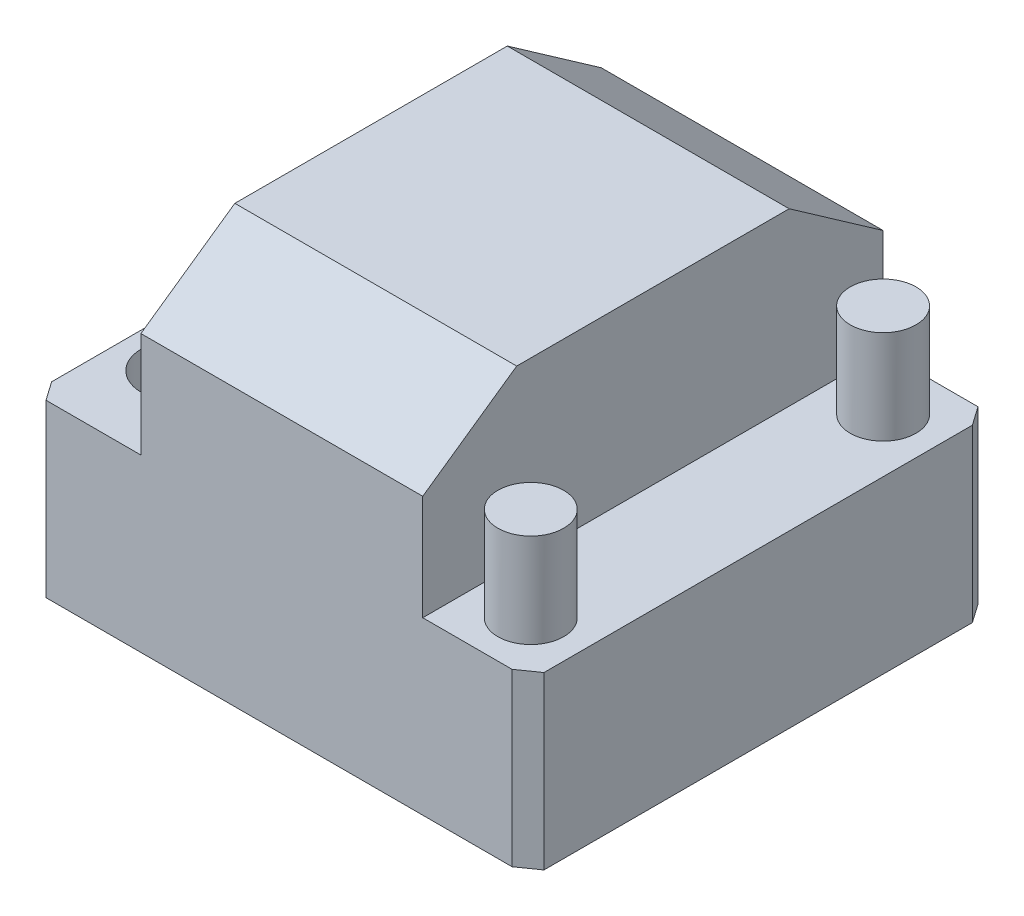
ISO-10303-21;
HEADER;
FILE_DESCRIPTION(('STEP AP214'),'2;1');
FILE_NAME('part.step','',(''),(''),'','','');
FILE_SCHEMA(('AUTOMOTIVE_DESIGN { 1 0 10303 214 1 1 1 1 }'));
ENDSEC;
DATA;
#1=APPLICATION_CONTEXT('core data for automotive mechanical design processes');
#2=APPLICATION_PROTOCOL_DEFINITION('international standard','automotive_design',2000,#1);
#3=PRODUCT_CONTEXT('',#1,'mechanical');
#4=PRODUCT('Part','Part','',(#3));
#5=PRODUCT_RELATED_PRODUCT_CATEGORY('part','',(#4));
#6=PRODUCT_DEFINITION_FORMATION('','',#4);
#7=PRODUCT_DEFINITION_CONTEXT('part definition',#1,'design');
#8=PRODUCT_DEFINITION('design','',#6,#7);
#9=PRODUCT_DEFINITION_SHAPE('','',#8);
#10=(LENGTH_UNIT() NAMED_UNIT(*) SI_UNIT(.MILLI.,.METRE.));
#11=(NAMED_UNIT(*) PLANE_ANGLE_UNIT() SI_UNIT($,.RADIAN.));
#12=(NAMED_UNIT(*) SI_UNIT($,.STERADIAN.) SOLID_ANGLE_UNIT());
#13=UNCERTAINTY_MEASURE_WITH_UNIT(LENGTH_MEASURE(1.E-05),#10,'distance_accuracy_value','');
#14=(GEOMETRIC_REPRESENTATION_CONTEXT(3) GLOBAL_UNCERTAINTY_ASSIGNED_CONTEXT((#13)) GLOBAL_UNIT_ASSIGNED_CONTEXT((#10,
#11,#12)) REPRESENTATION_CONTEXT('',''));
#15=CARTESIAN_POINT('',(0.,0.,0.));
#16=DIRECTION('',(0.,0.,1.));
#17=DIRECTION('',(1.,0.,0.));
#18=AXIS2_PLACEMENT_3D('',#15,#16,#17);
#19=CARTESIAN_POINT('',(0.,36.4,0.));
#20=DIRECTION('',(1.,0.,0.));
#21=DIRECTION('',(0.,0.,-1.));
#22=AXIS2_PLACEMENT_3D('',#19,#20,#21);
#23=PLANE('',#22);
#24=DIRECTION('',(0.,0.,1.));
#25=VECTOR('',#24,1.);
#26=CARTESIAN_POINT('',(0.,18.2,0.));
#27=LINE('',#26,#25);
#28=CARTESIAN_POINT('',(0.,18.2,1.40041507641941));
#29=VERTEX_POINT('',#28);
#30=CARTESIAN_POINT('',(0.,18.2,47.));
#31=VERTEX_POINT('',#30);
#32=EDGE_CURVE('E165',#29,#31,#27,.T.);
#33=ORIENTED_EDGE('',*,*,#32,.F.);
#34=DIRECTION('',(0.,-1.,0.));
#35=VECTOR('',#34,1.);
#36=CARTESIAN_POINT('',(0.,36.4,1.40041507641941));
#37=LINE('',#36,#35);
#38=CARTESIAN_POINT('',(0.,0.,1.40041507641941));
#39=VERTEX_POINT('',#38);
#40=EDGE_CURVE('E251',#29,#39,#37,.T.);
#41=ORIENTED_EDGE('',*,*,#40,.T.);
#42=DIRECTION('',(0.,0.,1.));
#43=VECTOR('',#42,1.);
#44=CARTESIAN_POINT('',(0.,0.,0.));
#45=LINE('',#44,#43);
#46=CARTESIAN_POINT('',(0.,0.,47.));
#47=VERTEX_POINT('',#46);
#48=EDGE_CURVE('E178',#39,#47,#45,.T.);
#49=ORIENTED_EDGE('',*,*,#48,.T.);
#50=DIRECTION('',(0.,1.,0.));
#51=VECTOR('',#50,1.);
#52=CARTESIAN_POINT('',(0.,36.4,47.));
#53=LINE('',#52,#51);
#54=EDGE_CURVE('E57',#47,#31,#53,.T.);
#55=ORIENTED_EDGE('',*,*,#54,.T.);
#56=EDGE_LOOP('',(#33,#41,#49,#55));
#57=FACE_BOUND('',#56,.T.);
#58=ADVANCED_FACE('F41',(#57),#23,.F.);
#59=CARTESIAN_POINT('',(0.,36.4,49.));
#60=DIRECTION('',(0.,0.,-1.));
#61=DIRECTION('',(-1.,0.,0.));
#62=AXIS2_PLACEMENT_3D('',#59,#60,#61);
#63=PLANE('',#62);
#64=DIRECTION('',(1.,0.,0.));
#65=VECTOR('',#64,1.);
#66=CARTESIAN_POINT('',(0.,0.,49.));
#67=LINE('',#66,#65);
#68=CARTESIAN_POINT('',(1.40041507641943,0.,49.));
#69=VERTEX_POINT('',#68);
#70=CARTESIAN_POINT('',(51.,0.,49.));
#71=VERTEX_POINT('',#70);
#72=EDGE_CURVE('E199',#69,#71,#67,.T.);
#73=ORIENTED_EDGE('',*,*,#72,.T.);
#74=DIRECTION('',(0.,1.,0.));
#75=VECTOR('',#74,1.);
#76=CARTESIAN_POINT('',(51.,36.4,49.));
#77=LINE('',#76,#75);
#78=CARTESIAN_POINT('',(51.,18.2,49.));
#79=VERTEX_POINT('',#78);
#80=EDGE_CURVE('E248',#71,#79,#77,.T.);
#81=ORIENTED_EDGE('',*,*,#80,.T.);
#82=DIRECTION('',(1.,0.,0.));
#83=VECTOR('',#82,1.);
#84=CARTESIAN_POINT('',(53.,18.2,49.));
#85=LINE('',#84,#83);
#86=CARTESIAN_POINT('',(41.5,18.2,49.));
#87=VERTEX_POINT('',#86);
#88=EDGE_CURVE('E191',#87,#79,#85,.T.);
#89=ORIENTED_EDGE('',*,*,#88,.F.);
#90=DIRECTION('',(0.,-1.,0.));
#91=VECTOR('',#90,1.);
#92=CARTESIAN_POINT('',(41.5,36.4,49.));
#93=LINE('',#92,#91);
#94=CARTESIAN_POINT('',(41.5,29.3979246179029,49.));
#95=VERTEX_POINT('',#94);
#96=EDGE_CURVE('E175',#95,#87,#93,.T.);
#97=ORIENTED_EDGE('',*,*,#96,.F.);
#98=DIRECTION('',(-1.,0.,0.));
#99=VECTOR('',#98,1.);
#100=CARTESIAN_POINT('',(11.5,29.3979246179029,49.));
#101=LINE('',#100,#99);
#102=CARTESIAN_POINT('',(11.5,29.3979246179029,49.));
#103=VERTEX_POINT('',#102);
#104=EDGE_CURVE('E222',#95,#103,#101,.T.);
#105=ORIENTED_EDGE('',*,*,#104,.T.);
#106=DIRECTION('',(0.,1.,0.));
#107=VECTOR('',#106,1.);
#108=CARTESIAN_POINT('',(11.5,36.4,49.));
#109=LINE('',#108,#107);
#110=CARTESIAN_POINT('',(11.5,18.2,49.));
#111=VERTEX_POINT('',#110);
#112=EDGE_CURVE('E154',#111,#103,#109,.T.);
#113=ORIENTED_EDGE('',*,*,#112,.F.);
#114=DIRECTION('',(1.,0.,0.));
#115=VECTOR('',#114,1.);
#116=CARTESIAN_POINT('',(0.,18.2,49.));
#117=LINE('',#116,#115);
#118=CARTESIAN_POINT('',(1.40041507641943,18.2,49.));
#119=VERTEX_POINT('',#118);
#120=EDGE_CURVE('E160',#119,#111,#117,.T.);
#121=ORIENTED_EDGE('',*,*,#120,.F.);
#122=DIRECTION('',(0.,-1.,0.));
#123=VECTOR('',#122,1.);
#124=CARTESIAN_POINT('',(1.40041507641943,36.4,49.));
#125=LINE('',#124,#123);
#126=EDGE_CURVE('E245',#119,#69,#125,.T.);
#127=ORIENTED_EDGE('',*,*,#126,.T.);
#128=EDGE_LOOP('',(#73,#81,#89,#97,#105,#113,#121,#127));
#129=FACE_BOUND('',#128,.T.);
#130=ADVANCED_FACE('F290',(#129),#63,.F.);
#131=CARTESIAN_POINT('',(53.,36.4,0.));
#132=DIRECTION('',(-1.,0.,0.));
#133=DIRECTION('',(0.,0.,1.));
#134=AXIS2_PLACEMENT_3D('',#131,#132,#133);
#135=PLANE('',#134);
#136=DIRECTION('',(0.,0.,-1.));
#137=VECTOR('',#136,1.);
#138=CARTESIAN_POINT('',(53.,0.,0.));
#139=LINE('',#138,#137);
#140=CARTESIAN_POINT('',(53.,0.,47.5995849235806));
#141=VERTEX_POINT('',#140);
#142=CARTESIAN_POINT('',(53.,0.,2.00000000000002));
#143=VERTEX_POINT('',#142);
#144=EDGE_CURVE('E202',#141,#143,#139,.T.);
#145=ORIENTED_EDGE('',*,*,#144,.T.);
#146=DIRECTION('',(0.,1.,0.));
#147=VECTOR('',#146,1.);
#148=CARTESIAN_POINT('',(53.,36.4,2.00000000000002));
#149=LINE('',#148,#147);
#150=CARTESIAN_POINT('',(53.,18.2,2.00000000000002));
#151=VERTEX_POINT('',#150);
#152=EDGE_CURVE('E239',#143,#151,#149,.T.);
#153=ORIENTED_EDGE('',*,*,#152,.T.);
#154=DIRECTION('',(0.,0.,1.));
#155=VECTOR('',#154,1.);
#156=CARTESIAN_POINT('',(53.,18.2,0.));
#157=LINE('',#156,#155);
#158=CARTESIAN_POINT('',(53.,18.2,47.5995849235806));
#159=VERTEX_POINT('',#158);
#160=EDGE_CURVE('E187',#151,#159,#157,.T.);
#161=ORIENTED_EDGE('',*,*,#160,.T.);
#162=DIRECTION('',(0.,-1.,0.));
#163=VECTOR('',#162,1.);
#164=CARTESIAN_POINT('',(53.,36.4,47.5995849235806));
#165=LINE('',#164,#163);
#166=EDGE_CURVE('E236',#159,#141,#165,.T.);
#167=ORIENTED_EDGE('',*,*,#166,.T.);
#168=EDGE_LOOP('',(#145,#153,#161,#167));
#169=FACE_BOUND('',#168,.T.);
#170=ADVANCED_FACE('F294',(#169),#135,.F.);
#171=CARTESIAN_POINT('',(0.,36.4,0.));
#172=DIRECTION('',(0.,0.,1.));
#173=DIRECTION('',(1.,0.,0.));
#174=AXIS2_PLACEMENT_3D('',#171,#172,#173);
#175=PLANE('',#174);
#176=DIRECTION('',(1.,0.,0.));
#177=VECTOR('',#176,1.);
#178=CARTESIAN_POINT('',(53.,18.2,0.));
#179=LINE('',#178,#177);
#180=CARTESIAN_POINT('',(41.5,18.2,0.));
#181=VERTEX_POINT('',#180);
#182=CARTESIAN_POINT('',(51.5995849235806,18.2,0.));
#183=VERTEX_POINT('',#182);
#184=EDGE_CURVE('E183',#181,#183,#179,.T.);
#185=ORIENTED_EDGE('',*,*,#184,.T.);
#186=DIRECTION('',(0.,-1.,0.));
#187=VECTOR('',#186,1.);
#188=CARTESIAN_POINT('',(51.5995849235806,36.4,0.));
#189=LINE('',#188,#187);
#190=CARTESIAN_POINT('',(51.5995849235806,0.,0.));
#191=VERTEX_POINT('',#190);
#192=EDGE_CURVE('E225',#183,#191,#189,.T.);
#193=ORIENTED_EDGE('',*,*,#192,.T.);
#194=DIRECTION('',(-1.,0.,0.));
#195=VECTOR('',#194,1.);
#196=CARTESIAN_POINT('',(0.,0.,0.));
#197=LINE('',#196,#195);
#198=CARTESIAN_POINT('',(2.,0.,0.));
#199=VERTEX_POINT('',#198);
#200=EDGE_CURVE('E205',#191,#199,#197,.T.);
#201=ORIENTED_EDGE('',*,*,#200,.T.);
#202=DIRECTION('',(0.,1.,0.));
#203=VECTOR('',#202,1.);
#204=CARTESIAN_POINT('',(2.,36.4,0.));
#205=LINE('',#204,#203);
#206=CARTESIAN_POINT('',(2.,18.2,0.));
#207=VERTEX_POINT('',#206);
#208=EDGE_CURVE('E153',#199,#207,#205,.T.);
#209=ORIENTED_EDGE('',*,*,#208,.T.);
#210=DIRECTION('',(1.,0.,0.));
#211=VECTOR('',#210,1.);
#212=CARTESIAN_POINT('',(0.,18.2,0.));
#213=LINE('',#212,#211);
#214=CARTESIAN_POINT('',(11.5,18.2,0.));
#215=VERTEX_POINT('',#214);
#216=EDGE_CURVE('E144',#207,#215,#213,.T.);
#217=ORIENTED_EDGE('',*,*,#216,.T.);
#218=DIRECTION('',(0.,1.,0.));
#219=VECTOR('',#218,1.);
#220=CARTESIAN_POINT('',(11.5,36.4,0.));
#221=LINE('',#220,#219);
#222=CARTESIAN_POINT('',(11.5,29.3979246179029,0.));
#223=VERTEX_POINT('',#222);
#224=EDGE_CURVE('E149',#215,#223,#221,.T.);
#225=ORIENTED_EDGE('',*,*,#224,.T.);
#226=DIRECTION('',(1.,0.,0.));
#227=VECTOR('',#226,1.);
#228=CARTESIAN_POINT('',(41.5,29.3979246179029,0.));
#229=LINE('',#228,#227);
#230=CARTESIAN_POINT('',(41.5,29.3979246179029,0.));
#231=VERTEX_POINT('',#230);
#232=EDGE_CURVE('E216',#223,#231,#229,.T.);
#233=ORIENTED_EDGE('',*,*,#232,.T.);
#234=DIRECTION('',(0.,-1.,0.));
#235=VECTOR('',#234,1.);
#236=CARTESIAN_POINT('',(41.5,36.4,0.));
#237=LINE('',#236,#235);
#238=EDGE_CURVE('E194',#231,#181,#237,.T.);
#239=ORIENTED_EDGE('',*,*,#238,.T.);
#240=EDGE_LOOP('',(#185,#193,#201,#209,#217,#225,#233,#239));
#241=FACE_BOUND('',#240,.T.);
#242=ADVANCED_FACE('F147',(#241),#175,.F.);
#243=CARTESIAN_POINT('',(0.,36.4,0.));
#244=DIRECTION('',(0.,1.,0.));
#245=DIRECTION('',(0.,0.,1.));
#246=AXIS2_PLACEMENT_3D('',#243,#244,#245);
#247=PLANE('',#246);
#248=DIRECTION('',(0.,0.,1.));
#249=VECTOR('',#248,1.);
#250=CARTESIAN_POINT('',(41.5,36.4,0.));
#251=LINE('',#250,#249);
#252=CARTESIAN_POINT('',(41.5,36.4,10.));
#253=VERTEX_POINT('',#252);
#254=CARTESIAN_POINT('',(41.5,36.4,38.9999999999999));
#255=VERTEX_POINT('',#254);
#256=EDGE_CURVE('E180',#253,#255,#251,.T.);
#257=ORIENTED_EDGE('',*,*,#256,.F.);
#258=DIRECTION('',(-1.,0.,0.));
#259=VECTOR('',#258,1.);
#260=CARTESIAN_POINT('',(11.5,36.4,10.));
#261=LINE('',#260,#259);
#262=CARTESIAN_POINT('',(11.5,36.4,10.));
#263=VERTEX_POINT('',#262);
#264=EDGE_CURVE('E210',#253,#263,#261,.T.);
#265=ORIENTED_EDGE('',*,*,#264,.T.);
#266=DIRECTION('',(0.,0.,1.));
#267=VECTOR('',#266,1.);
#268=CARTESIAN_POINT('',(11.5,36.4,0.));
#269=LINE('',#268,#267);
#270=CARTESIAN_POINT('',(11.5,36.4,38.9999999999999));
#271=VERTEX_POINT('',#270);
#272=EDGE_CURVE('E164',#263,#271,#269,.T.);
#273=ORIENTED_EDGE('',*,*,#272,.T.);
#274=DIRECTION('',(1.,0.,0.));
#275=VECTOR('',#274,1.);
#276=CARTESIAN_POINT('',(41.5,36.4,38.9999999999999));
#277=LINE('',#276,#275);
#278=EDGE_CURVE('E207',#271,#255,#277,.T.);
#279=ORIENTED_EDGE('',*,*,#278,.T.);
#280=EDGE_LOOP('',(#257,#265,#273,#279));
#281=FACE_BOUND('',#280,.T.);
#282=ADVANCED_FACE('F301',(#281),#247,.T.);
#283=CARTESIAN_POINT('',(0.,0.,0.));
#284=DIRECTION('',(0.,1.,0.));
#285=DIRECTION('',(0.,0.,1.));
#286=AXIS2_PLACEMENT_3D('',#283,#284,#285);
#287=PLANE('',#286);
#288=ORIENTED_EDGE('',*,*,#200,.F.);
#289=DIRECTION('',(-0.573576436351044,0.,-0.819152044288994));
#290=VECTOR('',#289,1.);
#291=CARTESIAN_POINT('',(51.5995849235806,0.,0.));
#292=LINE('',#291,#290);
#293=EDGE_CURVE('E234',#191,#143,#292,.F.);
#294=ORIENTED_EDGE('',*,*,#293,.T.);
#295=ORIENTED_EDGE('',*,*,#144,.F.);
#296=DIRECTION('',(0.819152044288993,0.,-0.573576436351044));
#297=VECTOR('',#296,1.);
#298=CARTESIAN_POINT('',(53.,0.,47.5995849235806));
#299=LINE('',#298,#297);
#300=EDGE_CURVE('E232',#141,#71,#299,.F.);
#301=ORIENTED_EDGE('',*,*,#300,.T.);
#302=ORIENTED_EDGE('',*,*,#72,.F.);
#303=DIRECTION('',(0.573576436351046,0.,0.819152044288992));
#304=VECTOR('',#303,1.);
#305=CARTESIAN_POINT('',(1.40041507641943,0.,49.));
#306=LINE('',#305,#304);
#307=EDGE_CURVE('E228',#69,#47,#306,.F.);
#308=ORIENTED_EDGE('',*,*,#307,.T.);
#309=ORIENTED_EDGE('',*,*,#48,.F.);
#310=DIRECTION('',(-0.819152044288993,0.,0.573576436351044));
#311=VECTOR('',#310,1.);
#312=CARTESIAN_POINT('',(0.,0.,1.40041507641941));
#313=LINE('',#312,#311);
#314=EDGE_CURVE('E230',#39,#199,#313,.F.);
#315=ORIENTED_EDGE('',*,*,#314,.T.);
#316=EDGE_LOOP('',(#288,#294,#295,#301,#302,#308,#309,#315));
#317=FACE_BOUND('',#316,.T.);
#318=ADVANCED_FACE('F265',(#317),#287,.F.);
#319=CARTESIAN_POINT('',(53.,18.2,0.));
#320=DIRECTION('',(0.,-1.,0.));
#321=DIRECTION('',(0.,0.,-1.));
#322=AXIS2_PLACEMENT_3D('',#319,#320,#321);
#323=PLANE('',#322);
#324=CARTESIAN_POINT('',(47.25,18.2,5.75));
#325=DIRECTION('',(0.,-1.,0.));
#326=DIRECTION('',(0.,0.,-1.));
#327=AXIS2_PLACEMENT_3D('',#324,#325,#326);
#328=CIRCLE('',#327,3.5);
#329=CARTESIAN_POINT('',(47.25,18.2,2.25));
#330=VERTEX_POINT('',#329);
#331=EDGE_CURVE('E11',#330,#330,#328,.F.);
#332=ORIENTED_EDGE('',*,*,#331,.F.);
#333=EDGE_LOOP('',(#332));
#334=FACE_BOUND('',#333,.T.);
#335=CARTESIAN_POINT('',(47.25,18.2,43.25));
#336=DIRECTION('',(0.,-1.,0.));
#337=DIRECTION('',(0.,0.,-1.));
#338=AXIS2_PLACEMENT_3D('',#335,#336,#337);
#339=CIRCLE('',#338,3.5);
#340=CARTESIAN_POINT('',(47.25,18.2,39.75));
#341=VERTEX_POINT('',#340);
#342=EDGE_CURVE('E50',#341,#341,#339,.F.);
#343=ORIENTED_EDGE('',*,*,#342,.F.);
#344=EDGE_LOOP('',(#343));
#345=FACE_BOUND('',#344,.T.);
#346=ORIENTED_EDGE('',*,*,#160,.F.);
#347=DIRECTION('',(0.573576436351044,0.,0.819152044288994));
#348=VECTOR('',#347,1.);
#349=CARTESIAN_POINT('',(51.5995849235806,18.2,0.));
#350=LINE('',#349,#348);
#351=EDGE_CURVE('E243',#151,#183,#350,.F.);
#352=ORIENTED_EDGE('',*,*,#351,.T.);
#353=ORIENTED_EDGE('',*,*,#184,.F.);
#354=DIRECTION('',(0.,0.,1.));
#355=VECTOR('',#354,1.);
#356=CARTESIAN_POINT('',(41.5,18.2,0.));
#357=LINE('',#356,#355);
#358=EDGE_CURVE('E184',#181,#87,#357,.T.);
#359=ORIENTED_EDGE('',*,*,#358,.T.);
#360=ORIENTED_EDGE('',*,*,#88,.T.);
#361=DIRECTION('',(-0.819152044288993,0.,0.573576436351044));
#362=VECTOR('',#361,1.);
#363=CARTESIAN_POINT('',(53.,18.2,47.5995849235806));
#364=LINE('',#363,#362);
#365=EDGE_CURVE('E241',#79,#159,#364,.F.);
#366=ORIENTED_EDGE('',*,*,#365,.T.);
#367=EDGE_LOOP('',(#346,#352,#353,#359,#360,#366));
#368=FACE_BOUND('',#367,.T.);
#369=ADVANCED_FACE('F261',(#334,#345,#368),#323,.F.);
#370=CARTESIAN_POINT('',(41.5,36.4,0.));
#371=DIRECTION('',(-1.,0.,0.));
#372=DIRECTION('',(0.,0.,1.));
#373=AXIS2_PLACEMENT_3D('',#370,#371,#372);
#374=PLANE('',#373);
#375=ORIENTED_EDGE('',*,*,#238,.F.);
#376=DIRECTION('',(0.,0.573576436351044,0.819152044288993));
#377=VECTOR('',#376,1.);
#378=CARTESIAN_POINT('',(41.5,36.4,10.));
#379=LINE('',#378,#377);
#380=EDGE_CURVE('E220',#231,#253,#379,.T.);
#381=ORIENTED_EDGE('',*,*,#380,.T.);
#382=ORIENTED_EDGE('',*,*,#256,.T.);
#383=DIRECTION('',(0.,-0.573576436351044,0.819152044288993));
#384=VECTOR('',#383,1.);
#385=CARTESIAN_POINT('',(41.5,36.4,38.9999999999999));
#386=LINE('',#385,#384);
#387=EDGE_CURVE('E218',#255,#95,#386,.T.);
#388=ORIENTED_EDGE('',*,*,#387,.T.);
#389=ORIENTED_EDGE('',*,*,#96,.T.);
#390=ORIENTED_EDGE('',*,*,#358,.F.);
#391=EDGE_LOOP('',(#375,#381,#382,#388,#389,#390));
#392=FACE_BOUND('',#391,.T.);
#393=ADVANCED_FACE('F264',(#392),#374,.F.);
#394=CARTESIAN_POINT('',(11.5,36.4,0.));
#395=DIRECTION('',(1.,0.,0.));
#396=DIRECTION('',(0.,0.,-1.));
#397=AXIS2_PLACEMENT_3D('',#394,#395,#396);
#398=PLANE('',#397);
#399=ORIENTED_EDGE('',*,*,#272,.F.);
#400=DIRECTION('',(0.,-0.573576436351044,-0.819152044288993));
#401=VECTOR('',#400,1.);
#402=CARTESIAN_POINT('',(11.5,36.4,10.));
#403=LINE('',#402,#401);
#404=EDGE_CURVE('E169',#263,#223,#403,.T.);
#405=ORIENTED_EDGE('',*,*,#404,.T.);
#406=ORIENTED_EDGE('',*,*,#224,.F.);
#407=DIRECTION('',(0.,0.,1.));
#408=VECTOR('',#407,1.);
#409=CARTESIAN_POINT('',(11.5,18.2,0.));
#410=LINE('',#409,#408);
#411=EDGE_CURVE('E157',#215,#111,#410,.T.);
#412=ORIENTED_EDGE('',*,*,#411,.T.);
#413=ORIENTED_EDGE('',*,*,#112,.T.);
#414=DIRECTION('',(0.,0.573576436351044,-0.819152044288993));
#415=VECTOR('',#414,1.);
#416=CARTESIAN_POINT('',(11.5,36.4,38.9999999999999));
#417=LINE('',#416,#415);
#418=EDGE_CURVE('E213',#103,#271,#417,.T.);
#419=ORIENTED_EDGE('',*,*,#418,.T.);
#420=EDGE_LOOP('',(#399,#405,#406,#412,#413,#419));
#421=FACE_BOUND('',#420,.T.);
#422=ADVANCED_FACE('F168',(#421),#398,.F.);
#423=CARTESIAN_POINT('',(0.,18.2,0.));
#424=DIRECTION('',(0.,-1.,0.));
#425=DIRECTION('',(0.,0.,-1.));
#426=AXIS2_PLACEMENT_3D('',#423,#424,#425);
#427=PLANE('',#426);
#428=CARTESIAN_POINT('',(5.75,18.2,9.2002075382097));
#429=DIRECTION('',(0.,1.,0.));
#430=DIRECTION('',(0.,0.,1.));
#431=AXIS2_PLACEMENT_3D('',#428,#429,#430);
#432=CIRCLE('',#431,4.);
#433=CARTESIAN_POINT('',(5.75,18.2,13.2002075382097));
#434=VERTEX_POINT('',#433);
#435=EDGE_CURVE('E563',#434,#434,#432,.T.);
#436=ORIENTED_EDGE('',*,*,#435,.F.);
#437=EDGE_LOOP('',(#436));
#438=FACE_BOUND('',#437,.T.);
#439=CARTESIAN_POINT('',(5.75,18.2,39.2002075382097));
#440=DIRECTION('',(0.,1.,0.));
#441=DIRECTION('',(0.,0.,1.));
#442=AXIS2_PLACEMENT_3D('',#439,#440,#441);
#443=CIRCLE('',#442,4.);
#444=CARTESIAN_POINT('',(5.75,18.2,43.2002075382097));
#445=VERTEX_POINT('',#444);
#446=EDGE_CURVE('E568',#445,#445,#443,.T.);
#447=ORIENTED_EDGE('',*,*,#446,.F.);
#448=EDGE_LOOP('',(#447));
#449=FACE_BOUND('',#448,.T.);
#450=CARTESIAN_POINT('',(5.75,18.2,24.2002075382097));
#451=DIRECTION('',(0.,1.,0.));
#452=DIRECTION('',(0.,0.,1.));
#453=AXIS2_PLACEMENT_3D('',#450,#451,#452);
#454=CIRCLE('',#453,4.);
#455=CARTESIAN_POINT('',(5.75,18.2,28.2002075382097));
#456=VERTEX_POINT('',#455);
#457=EDGE_CURVE('E576',#456,#456,#454,.T.);
#458=ORIENTED_EDGE('',*,*,#457,.F.);
#459=EDGE_LOOP('',(#458));
#460=FACE_BOUND('',#459,.T.);
#461=ORIENTED_EDGE('',*,*,#216,.F.);
#462=DIRECTION('',(0.819152044288993,0.,-0.573576436351044));
#463=VECTOR('',#462,1.);
#464=CARTESIAN_POINT('',(0.,18.2,1.40041507641941));
#465=LINE('',#464,#463);
#466=EDGE_CURVE('E64',#207,#29,#465,.F.);
#467=ORIENTED_EDGE('',*,*,#466,.T.);
#468=ORIENTED_EDGE('',*,*,#32,.T.);
#469=DIRECTION('',(-0.573576436351046,0.,-0.819152044288992));
#470=VECTOR('',#469,1.);
#471=CARTESIAN_POINT('',(1.40041507641943,18.2,49.));
#472=LINE('',#471,#470);
#473=EDGE_CURVE('E254',#31,#119,#472,.F.);
#474=ORIENTED_EDGE('',*,*,#473,.T.);
#475=ORIENTED_EDGE('',*,*,#120,.T.);
#476=ORIENTED_EDGE('',*,*,#411,.F.);
#477=EDGE_LOOP('',(#461,#467,#468,#474,#475,#476));
#478=FACE_BOUND('',#477,.T.);
#479=ADVANCED_FACE('F158',(#438,#449,#460,#478),#427,.F.);
#480=CARTESIAN_POINT('',(0.,36.4,10.));
#481=DIRECTION('',(0.,0.819152044288993,-0.573576436351044));
#482=DIRECTION('',(1.,0.,0.));
#483=AXIS2_PLACEMENT_3D('',#480,#481,#482);
#484=PLANE('',#483);
#485=ORIENTED_EDGE('',*,*,#380,.F.);
#486=ORIENTED_EDGE('',*,*,#232,.F.);
#487=ORIENTED_EDGE('',*,*,#404,.F.);
#488=ORIENTED_EDGE('',*,*,#264,.F.);
#489=EDGE_LOOP('',(#485,#486,#487,#488));
#490=FACE_BOUND('',#489,.T.);
#491=ADVANCED_FACE('F310',(#490),#484,.T.);
#492=CARTESIAN_POINT('',(0.,36.4,38.9999999999999));
#493=DIRECTION('',(0.,0.819152044288993,0.573576436351044));
#494=DIRECTION('',(-1.,0.,0.));
#495=AXIS2_PLACEMENT_3D('',#492,#493,#494);
#496=PLANE('',#495);
#497=ORIENTED_EDGE('',*,*,#418,.F.);
#498=ORIENTED_EDGE('',*,*,#104,.F.);
#499=ORIENTED_EDGE('',*,*,#387,.F.);
#500=ORIENTED_EDGE('',*,*,#278,.F.);
#501=EDGE_LOOP('',(#497,#498,#499,#500));
#502=FACE_BOUND('',#501,.T.);
#503=ADVANCED_FACE('F316',(#502),#496,.T.);
#504=CARTESIAN_POINT('',(51.5995849235806,36.4,0.));
#505=DIRECTION('',(-0.819152044288994,0.,0.573576436351044));
#506=DIRECTION('',(0.,-1.,0.));
#507=AXIS2_PLACEMENT_3D('',#504,#505,#506);
#508=PLANE('',#507);
#509=ORIENTED_EDGE('',*,*,#351,.F.);
#510=ORIENTED_EDGE('',*,*,#152,.F.);
#511=ORIENTED_EDGE('',*,*,#293,.F.);
#512=ORIENTED_EDGE('',*,*,#192,.F.);
#513=EDGE_LOOP('',(#509,#510,#511,#512));
#514=FACE_BOUND('',#513,.T.);
#515=ADVANCED_FACE('F277',(#514),#508,.F.);
#516=CARTESIAN_POINT('',(53.,36.4,47.5995849235806));
#517=DIRECTION('',(-0.573576436351044,0.,-0.819152044288993));
#518=DIRECTION('',(0.,-1.,0.));
#519=AXIS2_PLACEMENT_3D('',#516,#517,#518);
#520=PLANE('',#519);
#521=ORIENTED_EDGE('',*,*,#365,.F.);
#522=ORIENTED_EDGE('',*,*,#80,.F.);
#523=ORIENTED_EDGE('',*,*,#300,.F.);
#524=ORIENTED_EDGE('',*,*,#166,.F.);
#525=EDGE_LOOP('',(#521,#522,#523,#524));
#526=FACE_BOUND('',#525,.T.);
#527=ADVANCED_FACE('F293',(#526),#520,.F.);
#528=CARTESIAN_POINT('',(0.,36.4,1.40041507641941));
#529=DIRECTION('',(0.573576436351044,0.,0.819152044288993));
#530=DIRECTION('',(0.,-1.,0.));
#531=AXIS2_PLACEMENT_3D('',#528,#529,#530);
#532=PLANE('',#531);
#533=ORIENTED_EDGE('',*,*,#466,.F.);
#534=ORIENTED_EDGE('',*,*,#208,.F.);
#535=ORIENTED_EDGE('',*,*,#314,.F.);
#536=ORIENTED_EDGE('',*,*,#40,.F.);
#537=EDGE_LOOP('',(#533,#534,#535,#536));
#538=FACE_BOUND('',#537,.T.);
#539=ADVANCED_FACE('F284',(#538),#532,.F.);
#540=CARTESIAN_POINT('',(1.40041507641943,36.4,49.));
#541=DIRECTION('',(0.819152044288992,0.,-0.573576436351045));
#542=DIRECTION('',(0.,-1.,0.));
#543=AXIS2_PLACEMENT_3D('',#540,#541,#542);
#544=PLANE('',#543);
#545=ORIENTED_EDGE('',*,*,#473,.F.);
#546=ORIENTED_EDGE('',*,*,#54,.F.);
#547=ORIENTED_EDGE('',*,*,#307,.F.);
#548=ORIENTED_EDGE('',*,*,#126,.F.);
#549=EDGE_LOOP('',(#545,#546,#547,#548));
#550=FACE_BOUND('',#549,.T.);
#551=ADVANCED_FACE('F44',(#550),#544,.F.);
#552=CARTESIAN_POINT('',(47.25,28.2,43.25));
#553=DIRECTION('',(0.,-1.,0.));
#554=DIRECTION('',(0.,0.,-1.));
#555=AXIS2_PLACEMENT_3D('',#552,#553,#554);
#556=CYLINDRICAL_SURFACE('',#555,3.5);
#557=CARTESIAN_POINT('',(47.25,28.2,43.25));
#558=DIRECTION('',(0.,1.,0.));
#559=DIRECTION('',(0.,0.,1.));
#560=AXIS2_PLACEMENT_3D('',#557,#558,#559);
#561=CIRCLE('',#560,3.5);
#562=CARTESIAN_POINT('',(47.25,28.2,46.75));
#563=VERTEX_POINT('',#562);
#564=EDGE_CURVE('E190',#563,#563,#561,.T.);
#565=ORIENTED_EDGE('',*,*,#564,.F.);
#566=EDGE_LOOP('',(#565));
#567=FACE_BOUND('',#566,.T.);
#568=ORIENTED_EDGE('',*,*,#342,.T.);
#569=EDGE_LOOP('',(#568));
#570=FACE_BOUND('',#569,.T.);
#571=ADVANCED_FACE('F259',(#567,#570),#556,.T.);
#572=CARTESIAN_POINT('',(47.25,28.2,43.25));
#573=DIRECTION('',(0.,1.,0.));
#574=DIRECTION('',(0.,0.,1.));
#575=AXIS2_PLACEMENT_3D('',#572,#573,#574);
#576=PLANE('',#575);
#577=ORIENTED_EDGE('',*,*,#564,.T.);
#578=EDGE_LOOP('',(#577));
#579=FACE_BOUND('',#578,.T.);
#580=ADVANCED_FACE('F342',(#579),#576,.T.);
#581=CARTESIAN_POINT('',(47.25,28.2,5.75));
#582=DIRECTION('',(0.,-1.,0.));
#583=DIRECTION('',(0.,0.,-1.));
#584=AXIS2_PLACEMENT_3D('',#581,#582,#583);
#585=CYLINDRICAL_SURFACE('',#584,3.5);
#586=CARTESIAN_POINT('',(47.25,28.2,5.75));
#587=DIRECTION('',(0.,1.,0.));
#588=DIRECTION('',(0.,0.,1.));
#589=AXIS2_PLACEMENT_3D('',#586,#587,#588);
#590=CIRCLE('',#589,3.5);
#591=CARTESIAN_POINT('',(47.25,28.2,9.25));
#592=VERTEX_POINT('',#591);
#593=EDGE_CURVE('E562',#592,#592,#590,.T.);
#594=ORIENTED_EDGE('',*,*,#593,.F.);
#595=EDGE_LOOP('',(#594));
#596=FACE_BOUND('',#595,.T.);
#597=ORIENTED_EDGE('',*,*,#331,.T.);
#598=EDGE_LOOP('',(#597));
#599=FACE_BOUND('',#598,.T.);
#600=ADVANCED_FACE('F348',(#596,#599),#585,.T.);
#601=CARTESIAN_POINT('',(47.25,28.2,5.75));
#602=DIRECTION('',(0.,1.,0.));
#603=DIRECTION('',(0.,0.,1.));
#604=AXIS2_PLACEMENT_3D('',#601,#602,#603);
#605=PLANE('',#604);
#606=ORIENTED_EDGE('',*,*,#593,.T.);
#607=EDGE_LOOP('',(#606));
#608=FACE_BOUND('',#607,.T.);
#609=ADVANCED_FACE('F443',(#608),#605,.T.);
#610=CARTESIAN_POINT('',(5.75,8.2,24.2002075382097));
#611=DIRECTION('',(0.,1.,0.));
#612=DIRECTION('',(0.,0.,1.));
#613=AXIS2_PLACEMENT_3D('',#610,#611,#612);
#614=CYLINDRICAL_SURFACE('',#613,4.);
#615=CARTESIAN_POINT('',(5.75,8.2,24.2002075382097));
#616=DIRECTION('',(0.,1.,0.));
#617=DIRECTION('',(0.,0.,1.));
#618=AXIS2_PLACEMENT_3D('',#615,#616,#617);
#619=CIRCLE('',#618,4.);
#620=CARTESIAN_POINT('',(5.75,8.2,28.2002075382097));
#621=VERTEX_POINT('',#620);
#622=EDGE_CURVE('E579',#621,#621,#619,.T.);
#623=ORIENTED_EDGE('',*,*,#622,.F.);
#624=EDGE_LOOP('',(#623));
#625=FACE_BOUND('',#624,.T.);
#626=ORIENTED_EDGE('',*,*,#457,.T.);
#627=EDGE_LOOP('',(#626));
#628=FACE_BOUND('',#627,.T.);
#629=ADVANCED_FACE('F454',(#625,#628),#614,.F.);
#630=CARTESIAN_POINT('',(5.75,8.2,24.2002075382097));
#631=DIRECTION('',(0.,1.,0.));
#632=DIRECTION('',(0.,0.,1.));
#633=AXIS2_PLACEMENT_3D('',#630,#631,#632);
#634=PLANE('',#633);
#635=ORIENTED_EDGE('',*,*,#622,.T.);
#636=EDGE_LOOP('',(#635));
#637=FACE_BOUND('',#636,.T.);
#638=ADVANCED_FACE('F464',(#637),#634,.T.);
#639=CARTESIAN_POINT('',(5.75,8.2,39.2002075382097));
#640=DIRECTION('',(0.,1.,0.));
#641=DIRECTION('',(0.,0.,1.));
#642=AXIS2_PLACEMENT_3D('',#639,#640,#641);
#643=CYLINDRICAL_SURFACE('',#642,4.);
#644=CARTESIAN_POINT('',(5.75,8.2,39.2002075382097));
#645=DIRECTION('',(0.,1.,0.));
#646=DIRECTION('',(0.,0.,1.));
#647=AXIS2_PLACEMENT_3D('',#644,#645,#646);
#648=CIRCLE('',#647,4.);
#649=CARTESIAN_POINT('',(5.75,8.2,43.2002075382097));
#650=VERTEX_POINT('',#649);
#651=EDGE_CURVE('E573',#650,#650,#648,.T.);
#652=ORIENTED_EDGE('',*,*,#651,.F.);
#653=EDGE_LOOP('',(#652));
#654=FACE_BOUND('',#653,.T.);
#655=ORIENTED_EDGE('',*,*,#446,.T.);
#656=EDGE_LOOP('',(#655));
#657=FACE_BOUND('',#656,.T.);
#658=ADVANCED_FACE('F476',(#654,#657),#643,.F.);
#659=CARTESIAN_POINT('',(5.75,8.2,39.2002075382097));
#660=DIRECTION('',(0.,1.,0.));
#661=DIRECTION('',(0.,0.,1.));
#662=AXIS2_PLACEMENT_3D('',#659,#660,#661);
#663=PLANE('',#662);
#664=ORIENTED_EDGE('',*,*,#651,.T.);
#665=EDGE_LOOP('',(#664));
#666=FACE_BOUND('',#665,.T.);
#667=ADVANCED_FACE('F488',(#666),#663,.T.);
#668=CARTESIAN_POINT('',(5.75,8.2,9.2002075382097));
#669=DIRECTION('',(0.,1.,0.));
#670=DIRECTION('',(0.,0.,1.));
#671=AXIS2_PLACEMENT_3D('',#668,#669,#670);
#672=CYLINDRICAL_SURFACE('',#671,4.);
#673=CARTESIAN_POINT('',(5.75,8.2,9.2002075382097));
#674=DIRECTION('',(0.,1.,0.));
#675=DIRECTION('',(0.,0.,1.));
#676=AXIS2_PLACEMENT_3D('',#673,#674,#675);
#677=CIRCLE('',#676,4.);
#678=CARTESIAN_POINT('',(5.75,8.2,13.2002075382097));
#679=VERTEX_POINT('',#678);
#680=EDGE_CURVE('E561',#679,#679,#677,.T.);
#681=ORIENTED_EDGE('',*,*,#680,.F.);
#682=EDGE_LOOP('',(#681));
#683=FACE_BOUND('',#682,.T.);
#684=ORIENTED_EDGE('',*,*,#435,.T.);
#685=EDGE_LOOP('',(#684));
#686=FACE_BOUND('',#685,.T.);
#687=ADVANCED_FACE('F500',(#683,#686),#672,.F.);
#688=CARTESIAN_POINT('',(5.75,8.2,9.2002075382097));
#689=DIRECTION('',(0.,1.,0.));
#690=DIRECTION('',(0.,0.,1.));
#691=AXIS2_PLACEMENT_3D('',#688,#689,#690);
#692=PLANE('',#691);
#693=ORIENTED_EDGE('',*,*,#680,.T.);
#694=EDGE_LOOP('',(#693));
#695=FACE_BOUND('',#694,.T.);
#696=ADVANCED_FACE('F512',(#695),#692,.T.);
#697=CLOSED_SHELL('',(#58,#130,#170,#242,#282,#318,#369,#393,#422,#479,#491,#503,#515,#527,#539,
#551,#571,#580,#600,#609,#629,#638,#658,#667,#687,#696));
#698=MANIFOLD_SOLID_BREP('B2',#697);
#699=ADVANCED_BREP_SHAPE_REPRESENTATION('',(#18,#698),#14);
#700=SHAPE_DEFINITION_REPRESENTATION(#9,#699);
ENDSEC;
END-ISO-10303-21;
